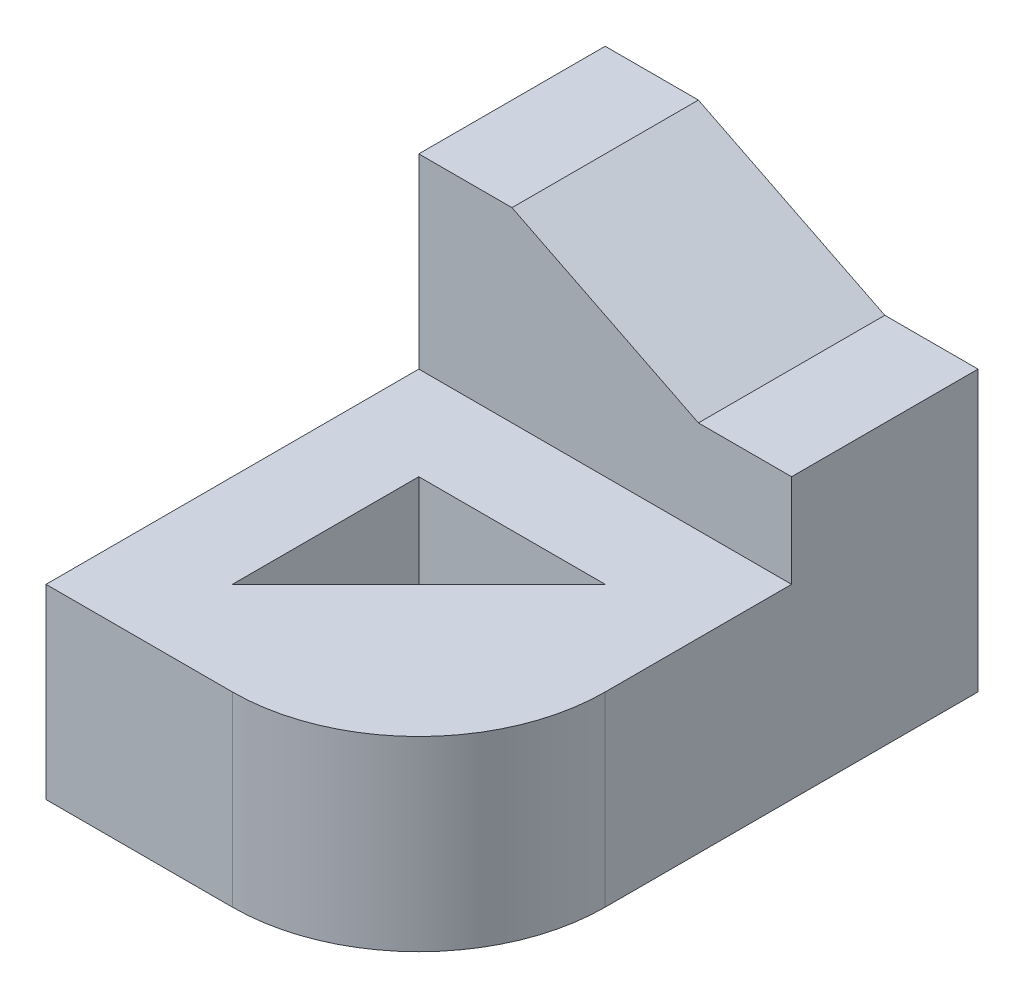
ISO-10303-21;
HEADER;
FILE_DESCRIPTION(('STEP AP214'),'2;1');
FILE_NAME('part.step','',(''),(''),'','','');
FILE_SCHEMA(('AUTOMOTIVE_DESIGN { 1 0 10303 214 1 1 1 1 }'));
ENDSEC;
DATA;
#1=APPLICATION_CONTEXT('core data for automotive mechanical design processes');
#2=APPLICATION_PROTOCOL_DEFINITION('international standard','automotive_design',2000,#1);
#3=PRODUCT_CONTEXT('',#1,'mechanical');
#4=PRODUCT('Part','Part','',(#3));
#5=PRODUCT_RELATED_PRODUCT_CATEGORY('part','',(#4));
#6=PRODUCT_DEFINITION_FORMATION('','',#4);
#7=PRODUCT_DEFINITION_CONTEXT('part definition',#1,'design');
#8=PRODUCT_DEFINITION('design','',#6,#7);
#9=PRODUCT_DEFINITION_SHAPE('','',#8);
#10=(LENGTH_UNIT() NAMED_UNIT(*) SI_UNIT(.MILLI.,.METRE.));
#11=(NAMED_UNIT(*) PLANE_ANGLE_UNIT() SI_UNIT($,.RADIAN.));
#12=(NAMED_UNIT(*) SI_UNIT($,.STERADIAN.) SOLID_ANGLE_UNIT());
#13=UNCERTAINTY_MEASURE_WITH_UNIT(LENGTH_MEASURE(1.E-05),#10,'distance_accuracy_value','');
#14=(GEOMETRIC_REPRESENTATION_CONTEXT(3) GLOBAL_UNCERTAINTY_ASSIGNED_CONTEXT((#13)) GLOBAL_UNIT_ASSIGNED_CONTEXT((#10,
#11,#12)) REPRESENTATION_CONTEXT('',''));
#15=CARTESIAN_POINT('',(0.,0.,0.));
#16=DIRECTION('',(0.,0.,1.));
#17=DIRECTION('',(1.,0.,0.));
#18=AXIS2_PLACEMENT_3D('',#15,#16,#17);
#19=CARTESIAN_POINT('',(0.,20.,9.99999999999999));
#20=DIRECTION('',(0.,1.,0.));
#21=DIRECTION('',(0.,0.,1.));
#22=AXIS2_PLACEMENT_3D('',#19,#20,#21);
#23=PLANE('',#22);
#24=DIRECTION('',(0.,0.,1.));
#25=VECTOR('',#24,1.);
#26=CARTESIAN_POINT('',(-10.,20.,0.));
#27=LINE('',#26,#25);
#28=CARTESIAN_POINT('',(-10.,20.,0.));
#29=VERTEX_POINT('',#28);
#30=CARTESIAN_POINT('',(-10.,20.,20.));
#31=VERTEX_POINT('',#30);
#32=EDGE_CURVE('E173',#29,#31,#27,.T.);
#33=ORIENTED_EDGE('',*,*,#32,.F.);
#34=DIRECTION('',(-1.,0.,0.));
#35=VECTOR('',#34,1.);
#36=CARTESIAN_POINT('',(9.99999999999999,20.,0.));
#37=LINE('',#36,#35);
#38=CARTESIAN_POINT('',(9.99999999999999,20.,0.));
#39=VERTEX_POINT('',#38);
#40=EDGE_CURVE('E171',#39,#29,#37,.T.);
#41=ORIENTED_EDGE('',*,*,#40,.F.);
#42=DIRECTION('',(0.707106781186547,0.,-0.707106781186548));
#43=VECTOR('',#42,1.);
#44=CARTESIAN_POINT('',(-10.,20.,20.));
#45=LINE('',#44,#43);
#46=EDGE_CURVE('E176',#31,#39,#45,.T.);
#47=ORIENTED_EDGE('',*,*,#46,.F.);
#48=EDGE_LOOP('',(#33,#41,#47));
#49=FACE_BOUND('',#48,.T.);
#50=DIRECTION('',(0.,0.,-1.));
#51=VECTOR('',#50,1.);
#52=CARTESIAN_POINT('',(20.,20.,-30.));
#53=LINE('',#52,#51);
#54=CARTESIAN_POINT('',(20.,20.,9.99999999999984));
#55=VERTEX_POINT('',#54);
#56=CARTESIAN_POINT('',(20.,20.,-10.));
#57=VERTEX_POINT('',#56);
#58=EDGE_CURVE('E199',#55,#57,#53,.T.);
#59=ORIENTED_EDGE('',*,*,#58,.T.);
#60=DIRECTION('',(-1.,0.,0.));
#61=VECTOR('',#60,1.);
#62=CARTESIAN_POINT('',(20.,20.,-10.));
#63=LINE('',#62,#61);
#64=CARTESIAN_POINT('',(-20.,20.,-10.));
#65=VERTEX_POINT('',#64);
#66=EDGE_CURVE('E147',#57,#65,#63,.T.);
#67=ORIENTED_EDGE('',*,*,#66,.T.);
#68=DIRECTION('',(0.,0.,1.));
#69=VECTOR('',#68,1.);
#70=CARTESIAN_POINT('',(-20.,20.,-30.));
#71=LINE('',#70,#69);
#72=CARTESIAN_POINT('',(-20.,20.,30.));
#73=VERTEX_POINT('',#72);
#74=EDGE_CURVE('E146',#65,#73,#71,.T.);
#75=ORIENTED_EDGE('',*,*,#74,.T.);
#76=DIRECTION('',(1.,0.,0.));
#77=VECTOR('',#76,1.);
#78=CARTESIAN_POINT('',(-20.,20.,30.));
#79=LINE('',#78,#77);
#80=CARTESIAN_POINT('',(-1.49047441055927E-13,20.,30.));
#81=VERTEX_POINT('',#80);
#82=EDGE_CURVE('E194',#73,#81,#79,.T.);
#83=ORIENTED_EDGE('',*,*,#82,.T.);
#84=CARTESIAN_POINT('',(0.,20.,9.99999999999999));
#85=DIRECTION('',(0.,1.,0.));
#86=DIRECTION('',(0.,0.,1.));
#87=AXIS2_PLACEMENT_3D('',#84,#85,#86);
#88=CIRCLE('',#87,20.);
#89=EDGE_CURVE('E197',#81,#55,#88,.T.);
#90=ORIENTED_EDGE('',*,*,#89,.T.);
#91=EDGE_LOOP('',(#59,#67,#75,#83,#90));
#92=FACE_BOUND('',#91,.T.);
#93=ADVANCED_FACE('F36',(#49,#92),#23,.T.);
#94=CARTESIAN_POINT('',(0.,0.,9.99999999999999));
#95=DIRECTION('',(0.,1.,0.));
#96=DIRECTION('',(0.,0.,1.));
#97=AXIS2_PLACEMENT_3D('',#94,#95,#96);
#98=PLANE('',#97);
#99=DIRECTION('',(0.,0.,1.));
#100=VECTOR('',#99,1.);
#101=CARTESIAN_POINT('',(-20.,0.,-30.));
#102=LINE('',#101,#100);
#103=CARTESIAN_POINT('',(-20.,0.,-30.));
#104=VERTEX_POINT('',#103);
#105=CARTESIAN_POINT('',(-20.,0.,30.));
#106=VERTEX_POINT('',#105);
#107=EDGE_CURVE('E192',#104,#106,#102,.T.);
#108=ORIENTED_EDGE('',*,*,#107,.F.);
#109=DIRECTION('',(-1.,0.,0.));
#110=VECTOR('',#109,1.);
#111=CARTESIAN_POINT('',(-20.,0.,-30.));
#112=LINE('',#111,#110);
#113=CARTESIAN_POINT('',(20.,0.,-30.));
#114=VERTEX_POINT('',#113);
#115=EDGE_CURVE('E195',#114,#104,#112,.T.);
#116=ORIENTED_EDGE('',*,*,#115,.F.);
#117=DIRECTION('',(0.,0.,-1.));
#118=VECTOR('',#117,1.);
#119=CARTESIAN_POINT('',(20.,0.,-30.));
#120=LINE('',#119,#118);
#121=CARTESIAN_POINT('',(20.,0.,9.99999999999984));
#122=VERTEX_POINT('',#121);
#123=EDGE_CURVE('E208',#122,#114,#120,.T.);
#124=ORIENTED_EDGE('',*,*,#123,.F.);
#125=CARTESIAN_POINT('',(0.,0.,9.99999999999999));
#126=DIRECTION('',(0.,1.,0.));
#127=DIRECTION('',(0.,0.,1.));
#128=AXIS2_PLACEMENT_3D('',#125,#126,#127);
#129=CIRCLE('',#128,20.);
#130=CARTESIAN_POINT('',(-1.49047441055927E-13,0.,30.));
#131=VERTEX_POINT('',#130);
#132=EDGE_CURVE('E206',#131,#122,#129,.T.);
#133=ORIENTED_EDGE('',*,*,#132,.F.);
#134=DIRECTION('',(1.,0.,0.));
#135=VECTOR('',#134,1.);
#136=CARTESIAN_POINT('',(-20.,0.,30.));
#137=LINE('',#136,#135);
#138=EDGE_CURVE('E204',#106,#131,#137,.T.);
#139=ORIENTED_EDGE('',*,*,#138,.F.);
#140=EDGE_LOOP('',(#108,#116,#124,#133,#139));
#141=FACE_BOUND('',#140,.T.);
#142=DIRECTION('',(-1.,0.,0.));
#143=VECTOR('',#142,1.);
#144=CARTESIAN_POINT('',(9.99999999999999,0.,0.));
#145=LINE('',#144,#143);
#146=CARTESIAN_POINT('',(9.99999999999999,0.,0.));
#147=VERTEX_POINT('',#146);
#148=CARTESIAN_POINT('',(-10.,0.,0.));
#149=VERTEX_POINT('',#148);
#150=EDGE_CURVE('E167',#147,#149,#145,.T.);
#151=ORIENTED_EDGE('',*,*,#150,.T.);
#152=DIRECTION('',(0.,0.,1.));
#153=VECTOR('',#152,1.);
#154=CARTESIAN_POINT('',(-10.,0.,0.));
#155=LINE('',#154,#153);
#156=CARTESIAN_POINT('',(-10.,0.,20.));
#157=VERTEX_POINT('',#156);
#158=EDGE_CURVE('E181',#149,#157,#155,.T.);
#159=ORIENTED_EDGE('',*,*,#158,.T.);
#160=DIRECTION('',(0.707106781186547,0.,-0.707106781186548));
#161=VECTOR('',#160,1.);
#162=CARTESIAN_POINT('',(-10.,0.,20.));
#163=LINE('',#162,#161);
#164=EDGE_CURVE('E174',#157,#147,#163,.T.);
#165=ORIENTED_EDGE('',*,*,#164,.T.);
#166=EDGE_LOOP('',(#151,#159,#165));
#167=FACE_BOUND('',#166,.T.);
#168=ADVANCED_FACE('F229',(#141,#167),#98,.F.);
#169=CARTESIAN_POINT('',(-20.,20.,-30.));
#170=DIRECTION('',(1.,0.,0.));
#171=DIRECTION('',(0.,0.,-1.));
#172=AXIS2_PLACEMENT_3D('',#169,#170,#171);
#173=PLANE('',#172);
#174=ORIENTED_EDGE('',*,*,#107,.T.);
#175=DIRECTION('',(0.,-1.,0.));
#176=VECTOR('',#175,1.);
#177=CARTESIAN_POINT('',(-20.,20.,30.));
#178=LINE('',#177,#176);
#179=EDGE_CURVE('E11',#73,#106,#178,.T.);
#180=ORIENTED_EDGE('',*,*,#179,.F.);
#181=ORIENTED_EDGE('',*,*,#74,.F.);
#182=DIRECTION('',(0.,1.,0.));
#183=VECTOR('',#182,1.);
#184=CARTESIAN_POINT('',(-20.,20.,-10.));
#185=LINE('',#184,#183);
#186=CARTESIAN_POINT('',(-20.,40.,-10.));
#187=VERTEX_POINT('',#186);
#188=EDGE_CURVE('E51',#65,#187,#185,.T.);
#189=ORIENTED_EDGE('',*,*,#188,.T.);
#190=DIRECTION('',(0.,0.,-1.));
#191=VECTOR('',#190,1.);
#192=CARTESIAN_POINT('',(-20.,40.,-10.));
#193=LINE('',#192,#191);
#194=CARTESIAN_POINT('',(-20.,40.,-30.));
#195=VERTEX_POINT('',#194);
#196=EDGE_CURVE('E127',#187,#195,#193,.T.);
#197=ORIENTED_EDGE('',*,*,#196,.T.);
#198=DIRECTION('',(0.,-1.,0.));
#199=VECTOR('',#198,1.);
#200=CARTESIAN_POINT('',(-20.,20.,-30.));
#201=LINE('',#200,#199);
#202=EDGE_CURVE('E202',#195,#104,#201,.T.);
#203=ORIENTED_EDGE('',*,*,#202,.T.);
#204=EDGE_LOOP('',(#174,#180,#181,#189,#197,#203));
#205=FACE_BOUND('',#204,.T.);
#206=ADVANCED_FACE('F38',(#205),#173,.F.);
#207=CARTESIAN_POINT('',(-20.,20.,30.));
#208=DIRECTION('',(0.,0.,-1.));
#209=DIRECTION('',(-1.,0.,0.));
#210=AXIS2_PLACEMENT_3D('',#207,#208,#209);
#211=PLANE('',#210);
#212=ORIENTED_EDGE('',*,*,#138,.T.);
#213=DIRECTION('',(0.,-1.,0.));
#214=VECTOR('',#213,1.);
#215=CARTESIAN_POINT('',(-1.49047441055927E-13,20.,30.));
#216=LINE('',#215,#214);
#217=EDGE_CURVE('E44',#81,#131,#216,.T.);
#218=ORIENTED_EDGE('',*,*,#217,.F.);
#219=ORIENTED_EDGE('',*,*,#82,.F.);
#220=ORIENTED_EDGE('',*,*,#179,.T.);
#221=EDGE_LOOP('',(#212,#218,#219,#220));
#222=FACE_BOUND('',#221,.T.);
#223=ADVANCED_FACE('F243',(#222),#211,.F.);
#224=CARTESIAN_POINT('',(0.,20.,9.99999999999999));
#225=DIRECTION('',(0.,-1.,0.));
#226=DIRECTION('',(0.,0.,-1.));
#227=AXIS2_PLACEMENT_3D('',#224,#225,#226);
#228=CYLINDRICAL_SURFACE('',#227,20.);
#229=ORIENTED_EDGE('',*,*,#132,.T.);
#230=DIRECTION('',(0.,-1.,0.));
#231=VECTOR('',#230,1.);
#232=CARTESIAN_POINT('',(20.,20.,9.99999999999984));
#233=LINE('',#232,#231);
#234=EDGE_CURVE('E215',#55,#122,#233,.T.);
#235=ORIENTED_EDGE('',*,*,#234,.F.);
#236=ORIENTED_EDGE('',*,*,#89,.F.);
#237=ORIENTED_EDGE('',*,*,#217,.T.);
#238=EDGE_LOOP('',(#229,#235,#236,#237));
#239=FACE_BOUND('',#238,.T.);
#240=ADVANCED_FACE('F222',(#239),#228,.T.);
#241=CARTESIAN_POINT('',(20.,20.,-30.));
#242=DIRECTION('',(-1.,0.,0.));
#243=DIRECTION('',(0.,0.,1.));
#244=AXIS2_PLACEMENT_3D('',#241,#242,#243);
#245=PLANE('',#244);
#246=ORIENTED_EDGE('',*,*,#123,.T.);
#247=DIRECTION('',(0.,-1.,0.));
#248=VECTOR('',#247,1.);
#249=CARTESIAN_POINT('',(20.,20.,-30.));
#250=LINE('',#249,#248);
#251=CARTESIAN_POINT('',(20.,30.,-30.));
#252=VERTEX_POINT('',#251);
#253=EDGE_CURVE('E212',#252,#114,#250,.T.);
#254=ORIENTED_EDGE('',*,*,#253,.F.);
#255=DIRECTION('',(0.,0.,-1.));
#256=VECTOR('',#255,1.);
#257=CARTESIAN_POINT('',(20.,30.,-10.));
#258=LINE('',#257,#256);
#259=CARTESIAN_POINT('',(20.,30.,-10.));
#260=VERTEX_POINT('',#259);
#261=EDGE_CURVE('E164',#260,#252,#258,.T.);
#262=ORIENTED_EDGE('',*,*,#261,.F.);
#263=DIRECTION('',(0.,-1.,0.));
#264=VECTOR('',#263,1.);
#265=CARTESIAN_POINT('',(20.,30.,-10.));
#266=LINE('',#265,#264);
#267=EDGE_CURVE('E135',#260,#57,#266,.T.);
#268=ORIENTED_EDGE('',*,*,#267,.T.);
#269=ORIENTED_EDGE('',*,*,#58,.F.);
#270=ORIENTED_EDGE('',*,*,#234,.T.);
#271=EDGE_LOOP('',(#246,#254,#262,#268,#269,#270));
#272=FACE_BOUND('',#271,.T.);
#273=ADVANCED_FACE('F233',(#272),#245,.F.);
#274=CARTESIAN_POINT('',(-20.,20.,-30.));
#275=DIRECTION('',(0.,0.,1.));
#276=DIRECTION('',(1.,0.,0.));
#277=AXIS2_PLACEMENT_3D('',#274,#275,#276);
#278=PLANE('',#277);
#279=ORIENTED_EDGE('',*,*,#115,.T.);
#280=ORIENTED_EDGE('',*,*,#202,.F.);
#281=DIRECTION('',(1.,0.,0.));
#282=VECTOR('',#281,1.);
#283=CARTESIAN_POINT('',(-20.,40.,-30.));
#284=LINE('',#283,#282);
#285=CARTESIAN_POINT('',(-10.,40.,-30.));
#286=VERTEX_POINT('',#285);
#287=EDGE_CURVE('E131',#195,#286,#284,.T.);
#288=ORIENTED_EDGE('',*,*,#287,.T.);
#289=DIRECTION('',(0.894427190999916,-0.447213595499958,0.));
#290=VECTOR('',#289,1.);
#291=CARTESIAN_POINT('',(-10.,40.,-30.));
#292=LINE('',#291,#290);
#293=CARTESIAN_POINT('',(9.99999999999999,30.,-30.));
#294=VERTEX_POINT('',#293);
#295=EDGE_CURVE('E159',#286,#294,#292,.T.);
#296=ORIENTED_EDGE('',*,*,#295,.T.);
#297=DIRECTION('',(1.,0.,0.));
#298=VECTOR('',#297,1.);
#299=CARTESIAN_POINT('',(9.99999999999999,30.,-30.));
#300=LINE('',#299,#298);
#301=EDGE_CURVE('E149',#294,#252,#300,.T.);
#302=ORIENTED_EDGE('',*,*,#301,.T.);
#303=ORIENTED_EDGE('',*,*,#253,.T.);
#304=EDGE_LOOP('',(#279,#280,#288,#296,#302,#303));
#305=FACE_BOUND('',#304,.T.);
#306=ADVANCED_FACE('F236',(#305),#278,.F.);
#307=CARTESIAN_POINT('',(9.99999999999999,20.,0.));
#308=DIRECTION('',(0.,0.,1.));
#309=DIRECTION('',(1.,0.,0.));
#310=AXIS2_PLACEMENT_3D('',#307,#308,#309);
#311=PLANE('',#310);
#312=ORIENTED_EDGE('',*,*,#150,.F.);
#313=DIRECTION('',(0.,-1.,0.));
#314=VECTOR('',#313,1.);
#315=CARTESIAN_POINT('',(9.99999999999999,20.,0.));
#316=LINE('',#315,#314);
#317=EDGE_CURVE('E178',#39,#147,#316,.T.);
#318=ORIENTED_EDGE('',*,*,#317,.F.);
#319=ORIENTED_EDGE('',*,*,#40,.T.);
#320=DIRECTION('',(0.,-1.,0.));
#321=VECTOR('',#320,1.);
#322=CARTESIAN_POINT('',(-10.,20.,0.));
#323=LINE('',#322,#321);
#324=EDGE_CURVE('E189',#29,#149,#323,.T.);
#325=ORIENTED_EDGE('',*,*,#324,.T.);
#326=EDGE_LOOP('',(#312,#318,#319,#325));
#327=FACE_BOUND('',#326,.T.);
#328=ADVANCED_FACE('F259',(#327),#311,.T.);
#329=CARTESIAN_POINT('',(-10.,20.,0.));
#330=DIRECTION('',(1.,0.,0.));
#331=DIRECTION('',(0.,0.,-1.));
#332=AXIS2_PLACEMENT_3D('',#329,#330,#331);
#333=PLANE('',#332);
#334=ORIENTED_EDGE('',*,*,#158,.F.);
#335=ORIENTED_EDGE('',*,*,#324,.F.);
#336=ORIENTED_EDGE('',*,*,#32,.T.);
#337=DIRECTION('',(0.,-1.,0.));
#338=VECTOR('',#337,1.);
#339=CARTESIAN_POINT('',(-10.,20.,20.));
#340=LINE('',#339,#338);
#341=EDGE_CURVE('E59',#31,#157,#340,.T.);
#342=ORIENTED_EDGE('',*,*,#341,.T.);
#343=EDGE_LOOP('',(#334,#335,#336,#342));
#344=FACE_BOUND('',#343,.T.);
#345=ADVANCED_FACE('F281',(#344),#333,.T.);
#346=CARTESIAN_POINT('',(-10.,20.,20.));
#347=DIRECTION('',(-0.707106781186548,0.,-0.707106781186547));
#348=DIRECTION('',(-0.707106781186547,0.,0.707106781186548));
#349=AXIS2_PLACEMENT_3D('',#346,#347,#348);
#350=PLANE('',#349);
#351=ORIENTED_EDGE('',*,*,#164,.F.);
#352=ORIENTED_EDGE('',*,*,#341,.F.);
#353=ORIENTED_EDGE('',*,*,#46,.T.);
#354=ORIENTED_EDGE('',*,*,#317,.T.);
#355=EDGE_LOOP('',(#351,#352,#353,#354));
#356=FACE_BOUND('',#355,.T.);
#357=ADVANCED_FACE('F288',(#356),#350,.T.);
#358=CARTESIAN_POINT('',(9.99999999999999,30.,-10.));
#359=DIRECTION('',(0.,1.,0.));
#360=DIRECTION('',(0.,0.,1.));
#361=AXIS2_PLACEMENT_3D('',#358,#359,#360);
#362=PLANE('',#361);
#363=ORIENTED_EDGE('',*,*,#301,.F.);
#364=DIRECTION('',(0.,0.,-1.));
#365=VECTOR('',#364,1.);
#366=CARTESIAN_POINT('',(9.99999999999999,30.,-10.));
#367=LINE('',#366,#365);
#368=CARTESIAN_POINT('',(9.99999999999999,30.,-10.));
#369=VERTEX_POINT('',#368);
#370=EDGE_CURVE('E168',#369,#294,#367,.T.);
#371=ORIENTED_EDGE('',*,*,#370,.F.);
#372=DIRECTION('',(1.,0.,0.));
#373=VECTOR('',#372,1.);
#374=CARTESIAN_POINT('',(9.99999999999999,30.,-10.));
#375=LINE('',#374,#373);
#376=EDGE_CURVE('E153',#369,#260,#375,.T.);
#377=ORIENTED_EDGE('',*,*,#376,.T.);
#378=ORIENTED_EDGE('',*,*,#261,.T.);
#379=EDGE_LOOP('',(#363,#371,#377,#378));
#380=FACE_BOUND('',#379,.T.);
#381=ADVANCED_FACE('F240',(#380),#362,.T.);
#382=CARTESIAN_POINT('',(-10.,40.,-10.));
#383=DIRECTION('',(0.447213595499958,0.894427190999916,0.));
#384=DIRECTION('',(-0.894427190999916,0.447213595499958,0.));
#385=AXIS2_PLACEMENT_3D('',#382,#383,#384);
#386=PLANE('',#385);
#387=ORIENTED_EDGE('',*,*,#295,.F.);
#388=DIRECTION('',(0.,0.,-1.));
#389=VECTOR('',#388,1.);
#390=CARTESIAN_POINT('',(-10.,40.,-10.));
#391=LINE('',#390,#389);
#392=CARTESIAN_POINT('',(-10.,40.,-10.));
#393=VERTEX_POINT('',#392);
#394=EDGE_CURVE('E134',#393,#286,#391,.T.);
#395=ORIENTED_EDGE('',*,*,#394,.F.);
#396=DIRECTION('',(0.894427190999916,-0.447213595499958,0.));
#397=VECTOR('',#396,1.);
#398=CARTESIAN_POINT('',(-10.,40.,-10.));
#399=LINE('',#398,#397);
#400=EDGE_CURVE('E141',#393,#369,#399,.T.);
#401=ORIENTED_EDGE('',*,*,#400,.T.);
#402=ORIENTED_EDGE('',*,*,#370,.T.);
#403=EDGE_LOOP('',(#387,#395,#401,#402));
#404=FACE_BOUND('',#403,.T.);
#405=ADVANCED_FACE('F300',(#404),#386,.T.);
#406=CARTESIAN_POINT('',(-20.,40.,-10.));
#407=DIRECTION('',(0.,1.,0.));
#408=DIRECTION('',(-1.,0.,0.));
#409=AXIS2_PLACEMENT_3D('',#406,#407,#408);
#410=PLANE('',#409);
#411=ORIENTED_EDGE('',*,*,#287,.F.);
#412=ORIENTED_EDGE('',*,*,#196,.F.);
#413=DIRECTION('',(1.,0.,0.));
#414=VECTOR('',#413,1.);
#415=CARTESIAN_POINT('',(-20.,40.,-10.));
#416=LINE('',#415,#414);
#417=EDGE_CURVE('E129',#187,#393,#416,.T.);
#418=ORIENTED_EDGE('',*,*,#417,.T.);
#419=ORIENTED_EDGE('',*,*,#394,.T.);
#420=EDGE_LOOP('',(#411,#412,#418,#419));
#421=FACE_BOUND('',#420,.T.);
#422=ADVANCED_FACE('F128',(#421),#410,.T.);
#423=CARTESIAN_POINT('',(0.,0.,-10.));
#424=DIRECTION('',(0.,0.,-1.));
#425=DIRECTION('',(-1.,0.,0.));
#426=AXIS2_PLACEMENT_3D('',#423,#424,#425);
#427=PLANE('',#426);
#428=ORIENTED_EDGE('',*,*,#66,.F.);
#429=ORIENTED_EDGE('',*,*,#267,.F.);
#430=ORIENTED_EDGE('',*,*,#376,.F.);
#431=ORIENTED_EDGE('',*,*,#400,.F.);
#432=ORIENTED_EDGE('',*,*,#417,.F.);
#433=ORIENTED_EDGE('',*,*,#188,.F.);
#434=EDGE_LOOP('',(#428,#429,#430,#431,#432,#433));
#435=FACE_BOUND('',#434,.T.);
#436=ADVANCED_FACE('F138',(#435),#427,.F.);
#437=CLOSED_SHELL('',(#93,#168,#206,#223,#240,#273,#306,#328,#345,#357,#381,#405,#422,#436));
#438=MANIFOLD_SOLID_BREP('B2',#437);
#439=ADVANCED_BREP_SHAPE_REPRESENTATION('',(#18,#438),#14);
#440=SHAPE_DEFINITION_REPRESENTATION(#9,#439);
ENDSEC;
END-ISO-10303-21;
